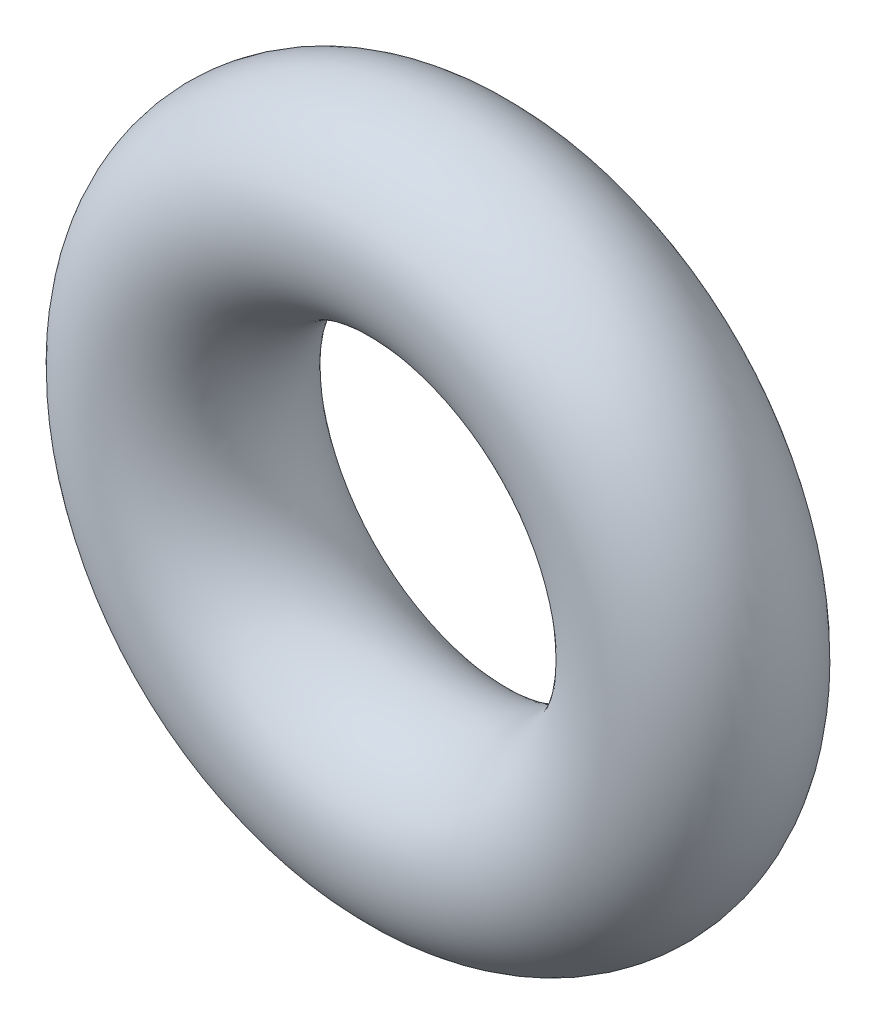
ISO-10303-21;
HEADER;
FILE_DESCRIPTION(('STEP AP214'),'2;1');
FILE_NAME('part.step','',(''),(''),'','','');
FILE_SCHEMA(('AUTOMOTIVE_DESIGN { 1 0 10303 214 1 1 1 1 }'));
ENDSEC;
DATA;
#1=APPLICATION_CONTEXT('core data for automotive mechanical design processes');
#2=APPLICATION_PROTOCOL_DEFINITION('international standard','automotive_design',2000,#1);
#3=PRODUCT_CONTEXT('',#1,'mechanical');
#4=PRODUCT('Part','Part','',(#3));
#5=PRODUCT_RELATED_PRODUCT_CATEGORY('part','',(#4));
#6=PRODUCT_DEFINITION_FORMATION('','',#4);
#7=PRODUCT_DEFINITION_CONTEXT('part definition',#1,'design');
#8=PRODUCT_DEFINITION('design','',#6,#7);
#9=PRODUCT_DEFINITION_SHAPE('','',#8);
#10=(LENGTH_UNIT() NAMED_UNIT(*) SI_UNIT(.MILLI.,.METRE.));
#11=(NAMED_UNIT(*) PLANE_ANGLE_UNIT() SI_UNIT($,.RADIAN.));
#12=(NAMED_UNIT(*) SI_UNIT($,.STERADIAN.) SOLID_ANGLE_UNIT());
#13=UNCERTAINTY_MEASURE_WITH_UNIT(LENGTH_MEASURE(1.E-05),#10,'distance_accuracy_value','');
#14=(GEOMETRIC_REPRESENTATION_CONTEXT(3) GLOBAL_UNCERTAINTY_ASSIGNED_CONTEXT((#13)) GLOBAL_UNIT_ASSIGNED_CONTEXT((#10,
#11,#12)) REPRESENTATION_CONTEXT('',''));
#15=CARTESIAN_POINT('',(0.,0.,0.));
#16=DIRECTION('',(0.,0.,1.));
#17=DIRECTION('',(1.,0.,0.));
#18=AXIS2_PLACEMENT_3D('',#15,#16,#17);
#19=CARTESIAN_POINT('',(0.,0.,0.));
#20=DIRECTION('',(0.,0.,1.));
#21=DIRECTION('',(1.,0.,0.));
#22=AXIS2_PLACEMENT_3D('',#19,#20,#21);
#23=TOROIDAL_SURFACE('',#22,2.5,0.95);
#24=CARTESIAN_POINT('',(3.45,0.,0.));
#25=VERTEX_POINT('',#24);
#26=VERTEX_LOOP('',#25);
#27=FACE_BOUND('',#26,.T.);
#28=ADVANCED_FACE('F33',(#27),#23,.T.);
#29=CLOSED_SHELL('',(#28));
#30=MANIFOLD_SOLID_BREP('B2',#29);
#31=ADVANCED_BREP_SHAPE_REPRESENTATION('',(#18,#30),#14);
#32=SHAPE_DEFINITION_REPRESENTATION(#9,#31);
ENDSEC;
END-ISO-10303-21;
